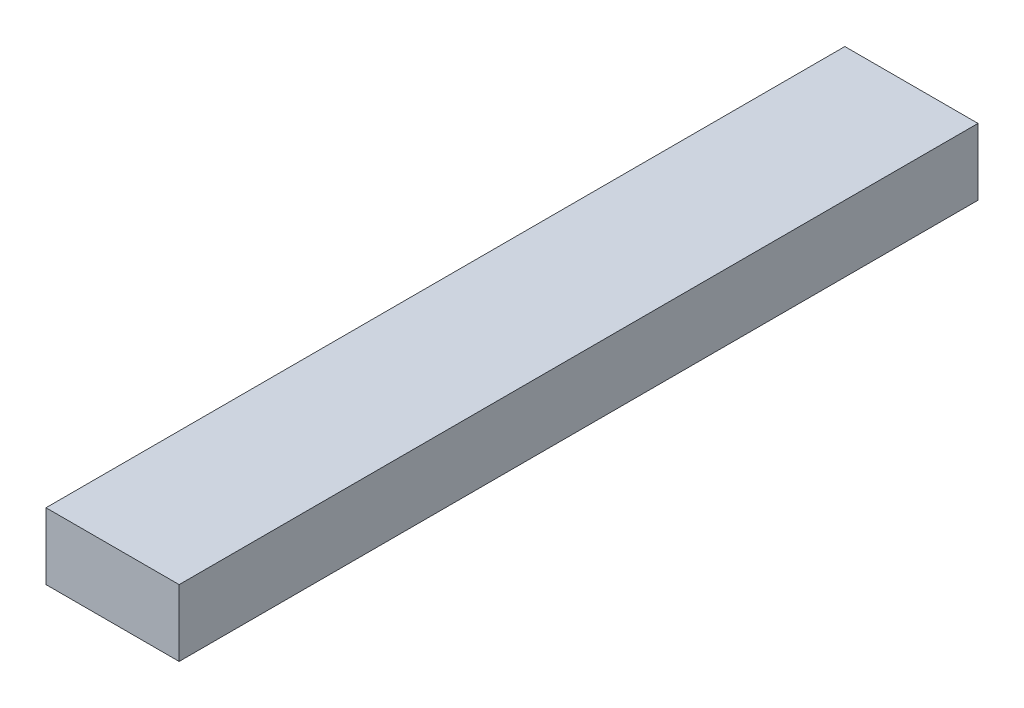
ISO-10303-21;
HEADER;
FILE_DESCRIPTION(('STEP AP214'),'2;1');
FILE_NAME('part.step','',(''),(''),'','','');
FILE_SCHEMA(('AUTOMOTIVE_DESIGN { 1 0 10303 214 1 1 1 1 }'));
ENDSEC;
DATA;
#1=APPLICATION_CONTEXT('core data for automotive mechanical design processes');
#2=APPLICATION_PROTOCOL_DEFINITION('international standard','automotive_design',2000,#1);
#3=PRODUCT_CONTEXT('',#1,'mechanical');
#4=PRODUCT('Part','Part','',(#3));
#5=PRODUCT_RELATED_PRODUCT_CATEGORY('part','',(#4));
#6=PRODUCT_DEFINITION_FORMATION('','',#4);
#7=PRODUCT_DEFINITION_CONTEXT('part definition',#1,'design');
#8=PRODUCT_DEFINITION('design','',#6,#7);
#9=PRODUCT_DEFINITION_SHAPE('','',#8);
#10=(LENGTH_UNIT() NAMED_UNIT(*) SI_UNIT(.MILLI.,.METRE.));
#11=(NAMED_UNIT(*) PLANE_ANGLE_UNIT() SI_UNIT($,.RADIAN.));
#12=(NAMED_UNIT(*) SI_UNIT($,.STERADIAN.) SOLID_ANGLE_UNIT());
#13=UNCERTAINTY_MEASURE_WITH_UNIT(LENGTH_MEASURE(1.E-05),#10,'distance_accuracy_value','');
#14=(GEOMETRIC_REPRESENTATION_CONTEXT(3) GLOBAL_UNCERTAINTY_ASSIGNED_CONTEXT((#13)) GLOBAL_UNIT_ASSIGNED_CONTEXT((#10,
#11,#12)) REPRESENTATION_CONTEXT('',''));
#15=CARTESIAN_POINT('',(0.,0.,0.));
#16=DIRECTION('',(0.,0.,1.));
#17=DIRECTION('',(1.,0.,0.));
#18=AXIS2_PLACEMENT_3D('',#15,#16,#17);
#19=CARTESIAN_POINT('',(-74.5506493506494,22.1012987012987,609.6));
#20=DIRECTION('',(1.,0.,0.));
#21=DIRECTION('',(0.,0.,-1.));
#22=AXIS2_PLACEMENT_3D('',#19,#20,#21);
#23=PLANE('',#22);
#24=DIRECTION('',(0.,-1.,0.));
#25=VECTOR('',#24,1.);
#26=CARTESIAN_POINT('',(-74.5506493506494,22.1012987012987,0.));
#27=LINE('',#26,#25);
#28=CARTESIAN_POINT('',(-74.5506493506494,22.1012987012987,0.));
#29=VERTEX_POINT('',#28);
#30=CARTESIAN_POINT('',(-74.5506493506494,-28.6987012987013,0.));
#31=VERTEX_POINT('',#30);
#32=EDGE_CURVE('E98',#29,#31,#27,.T.);
#33=ORIENTED_EDGE('',*,*,#32,.T.);
#34=DIRECTION('',(0.,0.,-1.));
#35=VECTOR('',#34,1.);
#36=CARTESIAN_POINT('',(-74.5506493506494,-28.6987012987013,609.6));
#37=LINE('',#36,#35);
#38=CARTESIAN_POINT('',(-74.5506493506494,-28.6987012987013,609.6));
#39=VERTEX_POINT('',#38);
#40=EDGE_CURVE('E11',#39,#31,#37,.T.);
#41=ORIENTED_EDGE('',*,*,#40,.F.);
#42=DIRECTION('',(0.,-1.,0.));
#43=VECTOR('',#42,1.);
#44=CARTESIAN_POINT('',(-74.5506493506494,22.1012987012987,609.6));
#45=LINE('',#44,#43);
#46=CARTESIAN_POINT('',(-74.5506493506494,22.1012987012987,609.6));
#47=VERTEX_POINT('',#46);
#48=EDGE_CURVE('E86',#47,#39,#45,.T.);
#49=ORIENTED_EDGE('',*,*,#48,.F.);
#50=DIRECTION('',(0.,0.,-1.));
#51=VECTOR('',#50,1.);
#52=CARTESIAN_POINT('',(-74.5506493506494,22.1012987012987,609.6));
#53=LINE('',#52,#51);
#54=EDGE_CURVE('E94',#47,#29,#53,.T.);
#55=ORIENTED_EDGE('',*,*,#54,.T.);
#56=EDGE_LOOP('',(#33,#41,#49,#55));
#57=FACE_BOUND('',#56,.T.);
#58=ADVANCED_FACE('F35',(#57),#23,.F.);
#59=CARTESIAN_POINT('',(-74.5506493506494,-28.6987012987013,609.6));
#60=DIRECTION('',(0.,1.,0.));
#61=DIRECTION('',(-1.,0.,0.));
#62=AXIS2_PLACEMENT_3D('',#59,#60,#61);
#63=PLANE('',#62);
#64=DIRECTION('',(1.,0.,0.));
#65=VECTOR('',#64,1.);
#66=CARTESIAN_POINT('',(-74.5506493506494,-28.6987012987013,0.));
#67=LINE('',#66,#65);
#68=CARTESIAN_POINT('',(27.0493506493506,-28.6987012987013,0.));
#69=VERTEX_POINT('',#68);
#70=EDGE_CURVE('E90',#31,#69,#67,.T.);
#71=ORIENTED_EDGE('',*,*,#70,.T.);
#72=DIRECTION('',(0.,0.,-1.));
#73=VECTOR('',#72,1.);
#74=CARTESIAN_POINT('',(27.0493506493506,-28.6987012987013,609.6));
#75=LINE('',#74,#73);
#76=CARTESIAN_POINT('',(27.0493506493506,-28.6987012987013,609.6));
#77=VERTEX_POINT('',#76);
#78=EDGE_CURVE('E43',#77,#69,#75,.T.);
#79=ORIENTED_EDGE('',*,*,#78,.F.);
#80=DIRECTION('',(1.,0.,0.));
#81=VECTOR('',#80,1.);
#82=CARTESIAN_POINT('',(-74.5506493506494,-28.6987012987013,609.6));
#83=LINE('',#82,#81);
#84=EDGE_CURVE('E81',#39,#77,#83,.T.);
#85=ORIENTED_EDGE('',*,*,#84,.F.);
#86=ORIENTED_EDGE('',*,*,#40,.T.);
#87=EDGE_LOOP('',(#71,#79,#85,#86));
#88=FACE_BOUND('',#87,.T.);
#89=ADVANCED_FACE('F89',(#88),#63,.F.);
#90=CARTESIAN_POINT('',(27.0493506493506,22.1012987012987,609.6));
#91=DIRECTION('',(-1.,0.,0.));
#92=DIRECTION('',(0.,0.,1.));
#93=AXIS2_PLACEMENT_3D('',#90,#91,#92);
#94=PLANE('',#93);
#95=DIRECTION('',(0.,1.,0.));
#96=VECTOR('',#95,1.);
#97=CARTESIAN_POINT('',(27.0493506493506,22.1012987012987,0.));
#98=LINE('',#97,#96);
#99=CARTESIAN_POINT('',(27.0493506493506,22.1012987012987,0.));
#100=VERTEX_POINT('',#99);
#101=EDGE_CURVE('E68',#69,#100,#98,.T.);
#102=ORIENTED_EDGE('',*,*,#101,.T.);
#103=DIRECTION('',(0.,0.,-1.));
#104=VECTOR('',#103,1.);
#105=CARTESIAN_POINT('',(27.0493506493506,22.1012987012987,609.6));
#106=LINE('',#105,#104);
#107=CARTESIAN_POINT('',(27.0493506493506,22.1012987012987,609.6));
#108=VERTEX_POINT('',#107);
#109=EDGE_CURVE('E91',#108,#100,#106,.T.);
#110=ORIENTED_EDGE('',*,*,#109,.F.);
#111=DIRECTION('',(0.,1.,0.));
#112=VECTOR('',#111,1.);
#113=CARTESIAN_POINT('',(27.0493506493506,22.1012987012987,609.6));
#114=LINE('',#113,#112);
#115=EDGE_CURVE('E84',#77,#108,#114,.T.);
#116=ORIENTED_EDGE('',*,*,#115,.F.);
#117=ORIENTED_EDGE('',*,*,#78,.T.);
#118=EDGE_LOOP('',(#102,#110,#116,#117));
#119=FACE_BOUND('',#118,.T.);
#120=ADVANCED_FACE('F92',(#119),#94,.F.);
#121=CARTESIAN_POINT('',(-74.5506493506494,22.1012987012987,609.6));
#122=DIRECTION('',(0.,-1.,0.));
#123=DIRECTION('',(0.,0.,-1.));
#124=AXIS2_PLACEMENT_3D('',#121,#122,#123);
#125=PLANE('',#124);
#126=DIRECTION('',(-1.,0.,0.));
#127=VECTOR('',#126,1.);
#128=CARTESIAN_POINT('',(-74.5506493506494,22.1012987012987,0.));
#129=LINE('',#128,#127);
#130=EDGE_CURVE('E74',#100,#29,#129,.T.);
#131=ORIENTED_EDGE('',*,*,#130,.T.);
#132=ORIENTED_EDGE('',*,*,#54,.F.);
#133=DIRECTION('',(-1.,0.,0.));
#134=VECTOR('',#133,1.);
#135=CARTESIAN_POINT('',(-74.5506493506494,22.1012987012987,609.6));
#136=LINE('',#135,#134);
#137=EDGE_CURVE('E51',#108,#47,#136,.T.);
#138=ORIENTED_EDGE('',*,*,#137,.F.);
#139=ORIENTED_EDGE('',*,*,#109,.T.);
#140=EDGE_LOOP('',(#131,#132,#138,#139));
#141=FACE_BOUND('',#140,.T.);
#142=ADVANCED_FACE('F105',(#141),#125,.F.);
#143=CARTESIAN_POINT('',(0.,0.,609.6));
#144=DIRECTION('',(0.,0.,1.));
#145=DIRECTION('',(1.,0.,0.));
#146=AXIS2_PLACEMENT_3D('',#143,#144,#145);
#147=PLANE('',#146);
#148=ORIENTED_EDGE('',*,*,#48,.T.);
#149=ORIENTED_EDGE('',*,*,#84,.T.);
#150=ORIENTED_EDGE('',*,*,#115,.T.);
#151=ORIENTED_EDGE('',*,*,#137,.T.);
#152=EDGE_LOOP('',(#148,#149,#150,#151));
#153=FACE_BOUND('',#152,.T.);
#154=ADVANCED_FACE('F82',(#153),#147,.T.);
#155=CARTESIAN_POINT('',(0.,0.,0.));
#156=DIRECTION('',(0.,0.,1.));
#157=DIRECTION('',(1.,0.,0.));
#158=AXIS2_PLACEMENT_3D('',#155,#156,#157);
#159=PLANE('',#158);
#160=ORIENTED_EDGE('',*,*,#32,.F.);
#161=ORIENTED_EDGE('',*,*,#130,.F.);
#162=ORIENTED_EDGE('',*,*,#101,.F.);
#163=ORIENTED_EDGE('',*,*,#70,.F.);
#164=EDGE_LOOP('',(#160,#161,#162,#163));
#165=FACE_BOUND('',#164,.T.);
#166=ADVANCED_FACE('F108',(#165),#159,.F.);
#167=CLOSED_SHELL('',(#58,#89,#120,#142,#154,#166));
#168=MANIFOLD_SOLID_BREP('B2',#167);
#169=ADVANCED_BREP_SHAPE_REPRESENTATION('',(#18,#168),#14);
#170=SHAPE_DEFINITION_REPRESENTATION(#9,#169);
ENDSEC;
END-ISO-10303-21;
